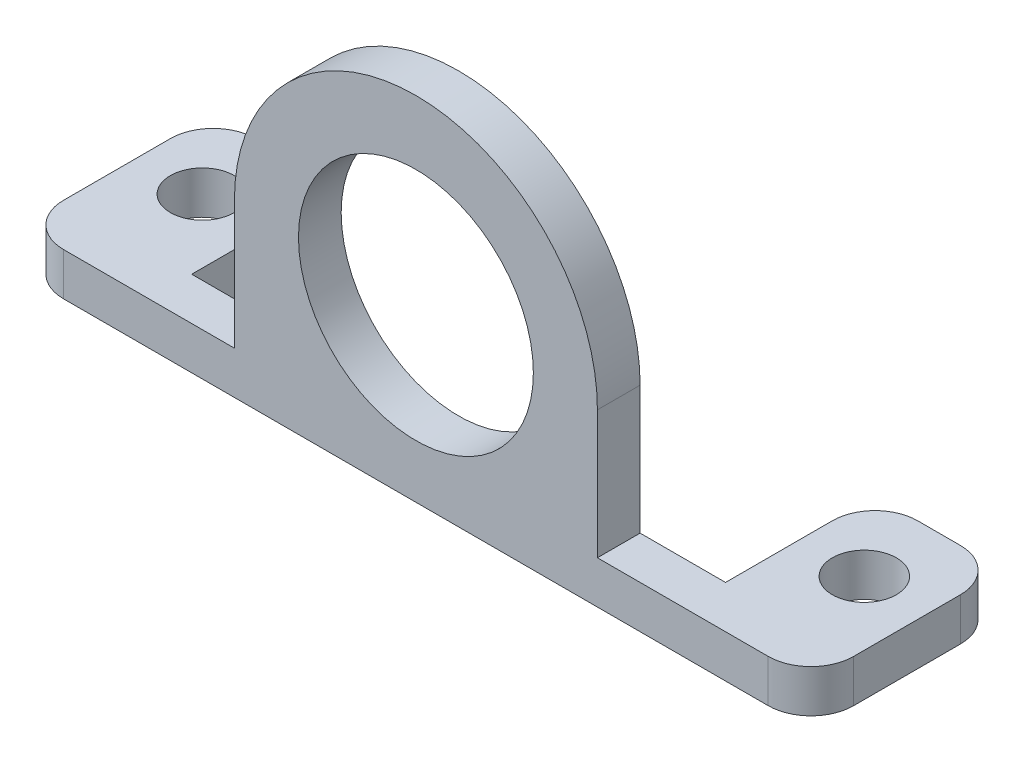
ISO-10303-21;
HEADER;
FILE_DESCRIPTION(('STEP AP214'),'2;1');
FILE_NAME('part.step','',(''),(''),'','','');
FILE_SCHEMA(('AUTOMOTIVE_DESIGN { 1 0 10303 214 1 1 1 1 }'));
ENDSEC;
DATA;
#1=APPLICATION_CONTEXT('core data for automotive mechanical design processes');
#2=APPLICATION_PROTOCOL_DEFINITION('international standard','automotive_design',2000,#1);
#3=PRODUCT_CONTEXT('',#1,'mechanical');
#4=PRODUCT('Part','Part','',(#3));
#5=PRODUCT_RELATED_PRODUCT_CATEGORY('part','',(#4));
#6=PRODUCT_DEFINITION_FORMATION('','',#4);
#7=PRODUCT_DEFINITION_CONTEXT('part definition',#1,'design');
#8=PRODUCT_DEFINITION('design','',#6,#7);
#9=PRODUCT_DEFINITION_SHAPE('','',#8);
#10=(LENGTH_UNIT() NAMED_UNIT(*) SI_UNIT(.MILLI.,.METRE.));
#11=(NAMED_UNIT(*) PLANE_ANGLE_UNIT() SI_UNIT($,.RADIAN.));
#12=(NAMED_UNIT(*) SI_UNIT($,.STERADIAN.) SOLID_ANGLE_UNIT());
#13=UNCERTAINTY_MEASURE_WITH_UNIT(LENGTH_MEASURE(1.E-05),#10,'distance_accuracy_value','');
#14=(GEOMETRIC_REPRESENTATION_CONTEXT(3) GLOBAL_UNCERTAINTY_ASSIGNED_CONTEXT((#13)) GLOBAL_UNIT_ASSIGNED_CONTEXT((#10,
#11,#12)) REPRESENTATION_CONTEXT('',''));
#15=CARTESIAN_POINT('',(0.,0.,0.));
#16=DIRECTION('',(0.,0.,1.));
#17=DIRECTION('',(1.,0.,0.));
#18=AXIS2_PLACEMENT_3D('',#15,#16,#17);
#19=CARTESIAN_POINT('',(0.,2.,0.));
#20=DIRECTION('',(0.,-1.,0.));
#21=DIRECTION('',(0.,0.,-1.));
#22=AXIS2_PLACEMENT_3D('',#19,#20,#21);
#23=PLANE('',#22);
#24=CARTESIAN_POINT('',(15.5,2.,0.));
#25=DIRECTION('',(0.,1.,0.));
#26=DIRECTION('',(0.,0.,-1.));
#27=AXIS2_PLACEMENT_3D('',#24,#25,#26);
#28=CIRCLE('',#27,1.5);
#29=CARTESIAN_POINT('',(15.5,2.,-1.5));
#30=VERTEX_POINT('',#29);
#31=EDGE_CURVE('E210',#30,#30,#28,.T.);
#32=ORIENTED_EDGE('',*,*,#31,.F.);
#33=EDGE_LOOP('',(#32));
#34=FACE_BOUND('',#33,.T.);
#35=DIRECTION('',(1.,0.,0.));
#36=VECTOR('',#35,1.);
#37=CARTESIAN_POINT('',(-18.5,2.,5.5));
#38=LINE('',#37,#36);
#39=CARTESIAN_POINT('',(8.5,2.,5.5));
#40=VERTEX_POINT('',#39);
#41=CARTESIAN_POINT('',(16.5,2.,5.5));
#42=VERTEX_POINT('',#41);
#43=EDGE_CURVE('E232',#40,#42,#38,.T.);
#44=ORIENTED_EDGE('',*,*,#43,.T.);
#45=CARTESIAN_POINT('',(16.5,2.,3.5));
#46=DIRECTION('',(0.,-1.,0.));
#47=DIRECTION('',(0.,0.,-1.));
#48=AXIS2_PLACEMENT_3D('',#45,#46,#47);
#49=CIRCLE('',#48,2.);
#50=CARTESIAN_POINT('',(18.5,2.,3.5));
#51=VERTEX_POINT('',#50);
#52=EDGE_CURVE('E305',#42,#51,#49,.F.);
#53=ORIENTED_EDGE('',*,*,#52,.T.);
#54=DIRECTION('',(0.,0.,-1.));
#55=VECTOR('',#54,1.);
#56=CARTESIAN_POINT('',(18.5,2.,3.5));
#57=LINE('',#56,#55);
#58=CARTESIAN_POINT('',(18.5,2.,-1.5));
#59=VERTEX_POINT('',#58);
#60=EDGE_CURVE('E235',#51,#59,#57,.T.);
#61=ORIENTED_EDGE('',*,*,#60,.T.);
#62=CARTESIAN_POINT('',(16.5,2.,-1.5));
#63=DIRECTION('',(0.,-1.,0.));
#64=DIRECTION('',(0.,0.,-1.));
#65=AXIS2_PLACEMENT_3D('',#62,#63,#64);
#66=CIRCLE('',#65,2.);
#67=CARTESIAN_POINT('',(16.5,2.,-3.5));
#68=VERTEX_POINT('',#67);
#69=EDGE_CURVE('E302',#59,#68,#66,.F.);
#70=ORIENTED_EDGE('',*,*,#69,.T.);
#71=DIRECTION('',(-1.,0.,0.));
#72=VECTOR('',#71,1.);
#73=CARTESIAN_POINT('',(18.5,2.,-3.5));
#74=LINE('',#73,#72);
#75=CARTESIAN_POINT('',(14.5,2.,-3.5));
#76=VERTEX_POINT('',#75);
#77=EDGE_CURVE('E238',#68,#76,#74,.T.);
#78=ORIENTED_EDGE('',*,*,#77,.T.);
#79=CARTESIAN_POINT('',(14.5,2.,-1.5));
#80=DIRECTION('',(0.,-1.,0.));
#81=DIRECTION('',(0.,0.,-1.));
#82=AXIS2_PLACEMENT_3D('',#79,#80,#81);
#83=CIRCLE('',#82,2.);
#84=CARTESIAN_POINT('',(12.5,2.,-1.5));
#85=VERTEX_POINT('',#84);
#86=EDGE_CURVE('E53',#76,#85,#83,.F.);
#87=ORIENTED_EDGE('',*,*,#86,.T.);
#88=DIRECTION('',(0.,0.,1.));
#89=VECTOR('',#88,1.);
#90=CARTESIAN_POINT('',(12.5,2.,3.5));
#91=LINE('',#90,#89);
#92=CARTESIAN_POINT('',(12.5,2.,3.5));
#93=VERTEX_POINT('',#92);
#94=EDGE_CURVE('E240',#85,#93,#91,.T.);
#95=ORIENTED_EDGE('',*,*,#94,.T.);
#96=DIRECTION('',(-1.,0.,0.));
#97=VECTOR('',#96,1.);
#98=CARTESIAN_POINT('',(-12.5,2.,3.5));
#99=LINE('',#98,#97);
#100=CARTESIAN_POINT('',(8.49999999999999,2.,3.5));
#101=VERTEX_POINT('',#100);
#102=EDGE_CURVE('E242',#93,#101,#99,.T.);
#103=ORIENTED_EDGE('',*,*,#102,.T.);
#104=DIRECTION('',(0.,0.,1.));
#105=VECTOR('',#104,1.);
#106=CARTESIAN_POINT('',(8.5,2.,0.));
#107=LINE('',#106,#105);
#108=EDGE_CURVE('E206',#101,#40,#107,.T.);
#109=ORIENTED_EDGE('',*,*,#108,.T.);
#110=EDGE_LOOP('',(#44,#53,#61,#70,#78,#87,#95,#103,#109));
#111=FACE_BOUND('',#110,.T.);
#112=ADVANCED_FACE('F38',(#34,#111),#23,.F.);
#113=DIRECTION('',(0.,0.,1.));
#114=VECTOR('',#113,1.);
#115=CARTESIAN_POINT('',(-18.5,2.,3.5));
#116=LINE('',#115,#114);
#117=CARTESIAN_POINT('',(-18.5,2.,-1.5));
#118=VERTEX_POINT('',#117);
#119=CARTESIAN_POINT('',(-18.5,2.,3.5));
#120=VERTEX_POINT('',#119);
#121=EDGE_CURVE('E229',#118,#120,#116,.T.);
#122=ORIENTED_EDGE('',*,*,#121,.T.);
#123=CARTESIAN_POINT('',(-16.5,2.,3.5));
#124=DIRECTION('',(0.,-1.,0.));
#125=DIRECTION('',(0.,0.,-1.));
#126=AXIS2_PLACEMENT_3D('',#123,#124,#125);
#127=CIRCLE('',#126,2.);
#128=CARTESIAN_POINT('',(-16.5,2.,5.5));
#129=VERTEX_POINT('',#128);
#130=EDGE_CURVE('E295',#120,#129,#127,.F.);
#131=ORIENTED_EDGE('',*,*,#130,.T.);
#132=CARTESIAN_POINT('',(-8.5,2.,5.5));
#133=VERTEX_POINT('',#132);
#134=EDGE_CURVE('E233',#129,#133,#38,.T.);
#135=ORIENTED_EDGE('',*,*,#134,.T.);
#136=DIRECTION('',(0.,0.,-1.));
#137=VECTOR('',#136,1.);
#138=CARTESIAN_POINT('',(-8.5,2.,0.));
#139=LINE('',#138,#137);
#140=CARTESIAN_POINT('',(-8.5,2.,3.5));
#141=VERTEX_POINT('',#140);
#142=EDGE_CURVE('E203',#133,#141,#139,.T.);
#143=ORIENTED_EDGE('',*,*,#142,.T.);
#144=CARTESIAN_POINT('',(-12.5,2.,3.5));
#145=VERTEX_POINT('',#144);
#146=EDGE_CURVE('E186',#141,#145,#99,.T.);
#147=ORIENTED_EDGE('',*,*,#146,.T.);
#148=DIRECTION('',(0.,0.,-1.));
#149=VECTOR('',#148,1.);
#150=CARTESIAN_POINT('',(-12.5,2.,3.5));
#151=LINE('',#150,#149);
#152=CARTESIAN_POINT('',(-12.5,2.,-1.5));
#153=VERTEX_POINT('',#152);
#154=EDGE_CURVE('E222',#145,#153,#151,.T.);
#155=ORIENTED_EDGE('',*,*,#154,.T.);
#156=CARTESIAN_POINT('',(-14.5,2.,-1.5));
#157=DIRECTION('',(0.,-1.,0.));
#158=DIRECTION('',(0.,0.,-1.));
#159=AXIS2_PLACEMENT_3D('',#156,#157,#158);
#160=CIRCLE('',#159,2.);
#161=CARTESIAN_POINT('',(-14.5,2.,-3.5));
#162=VERTEX_POINT('',#161);
#163=EDGE_CURVE('E293',#153,#162,#160,.F.);
#164=ORIENTED_EDGE('',*,*,#163,.T.);
#165=DIRECTION('',(-1.,0.,0.));
#166=VECTOR('',#165,1.);
#167=CARTESIAN_POINT('',(-18.5,2.,-3.5));
#168=LINE('',#167,#166);
#169=CARTESIAN_POINT('',(-16.5,2.,-3.5));
#170=VERTEX_POINT('',#169);
#171=EDGE_CURVE('E225',#162,#170,#168,.T.);
#172=ORIENTED_EDGE('',*,*,#171,.T.);
#173=CARTESIAN_POINT('',(-16.5,2.,-1.5));
#174=DIRECTION('',(0.,-1.,0.));
#175=DIRECTION('',(0.,0.,-1.));
#176=AXIS2_PLACEMENT_3D('',#173,#174,#175);
#177=CIRCLE('',#176,2.);
#178=EDGE_CURVE('E291',#170,#118,#177,.F.);
#179=ORIENTED_EDGE('',*,*,#178,.T.);
#180=EDGE_LOOP('',(#122,#131,#135,#143,#147,#155,#164,#172,#179));
#181=FACE_BOUND('',#180,.T.);
#182=CARTESIAN_POINT('',(-15.5,2.,0.));
#183=DIRECTION('',(0.,1.,0.));
#184=DIRECTION('',(0.,0.,1.));
#185=AXIS2_PLACEMENT_3D('',#182,#183,#184);
#186=CIRCLE('',#185,1.5);
#187=CARTESIAN_POINT('',(-15.5,2.,1.5));
#188=VERTEX_POINT('',#187);
#189=EDGE_CURVE('E216',#188,#188,#186,.T.);
#190=ORIENTED_EDGE('',*,*,#189,.F.);
#191=EDGE_LOOP('',(#190));
#192=FACE_BOUND('',#191,.T.);
#193=ADVANCED_FACE('F339',(#181,#192),#23,.F.);
#194=CARTESIAN_POINT('',(0.,0.,0.));
#195=DIRECTION('',(0.,-1.,0.));
#196=DIRECTION('',(0.,0.,-1.));
#197=AXIS2_PLACEMENT_3D('',#194,#195,#196);
#198=PLANE('',#197);
#199=DIRECTION('',(1.,0.,0.));
#200=VECTOR('',#199,1.);
#201=CARTESIAN_POINT('',(-18.5,0.,5.5));
#202=LINE('',#201,#200);
#203=CARTESIAN_POINT('',(-16.5,0.,5.5));
#204=VERTEX_POINT('',#203);
#205=CARTESIAN_POINT('',(16.5,0.,5.5));
#206=VERTEX_POINT('',#205);
#207=EDGE_CURVE('E253',#204,#206,#202,.T.);
#208=ORIENTED_EDGE('',*,*,#207,.F.);
#209=CARTESIAN_POINT('',(-16.5,0.,3.5));
#210=DIRECTION('',(0.,-1.,0.));
#211=DIRECTION('',(0.,0.,-1.));
#212=AXIS2_PLACEMENT_3D('',#209,#210,#211);
#213=CIRCLE('',#212,2.);
#214=CARTESIAN_POINT('',(-18.5,0.,3.5));
#215=VERTEX_POINT('',#214);
#216=EDGE_CURVE('E284',#204,#215,#213,.T.);
#217=ORIENTED_EDGE('',*,*,#216,.T.);
#218=DIRECTION('',(0.,0.,1.));
#219=VECTOR('',#218,1.);
#220=CARTESIAN_POINT('',(-18.5,0.,3.5));
#221=LINE('',#220,#219);
#222=CARTESIAN_POINT('',(-18.5,0.,-1.5));
#223=VERTEX_POINT('',#222);
#224=EDGE_CURVE('E250',#223,#215,#221,.T.);
#225=ORIENTED_EDGE('',*,*,#224,.F.);
#226=CARTESIAN_POINT('',(-16.5,0.,-1.5));
#227=DIRECTION('',(0.,-1.,0.));
#228=DIRECTION('',(0.,0.,-1.));
#229=AXIS2_PLACEMENT_3D('',#226,#227,#228);
#230=CIRCLE('',#229,2.);
#231=CARTESIAN_POINT('',(-16.5,0.,-3.5));
#232=VERTEX_POINT('',#231);
#233=EDGE_CURVE('E274',#223,#232,#230,.T.);
#234=ORIENTED_EDGE('',*,*,#233,.T.);
#235=DIRECTION('',(-1.,0.,0.));
#236=VECTOR('',#235,1.);
#237=CARTESIAN_POINT('',(-18.5,0.,-3.5));
#238=LINE('',#237,#236);
#239=CARTESIAN_POINT('',(-14.5,0.,-3.5));
#240=VERTEX_POINT('',#239);
#241=EDGE_CURVE('E247',#240,#232,#238,.T.);
#242=ORIENTED_EDGE('',*,*,#241,.F.);
#243=CARTESIAN_POINT('',(-14.5,0.,-1.5));
#244=DIRECTION('',(0.,-1.,0.));
#245=DIRECTION('',(0.,0.,-1.));
#246=AXIS2_PLACEMENT_3D('',#243,#244,#245);
#247=CIRCLE('',#246,2.);
#248=CARTESIAN_POINT('',(-12.5,0.,-1.5));
#249=VERTEX_POINT('',#248);
#250=EDGE_CURVE('E276',#240,#249,#247,.T.);
#251=ORIENTED_EDGE('',*,*,#250,.T.);
#252=DIRECTION('',(0.,0.,-1.));
#253=VECTOR('',#252,1.);
#254=CARTESIAN_POINT('',(-12.5,0.,3.5));
#255=LINE('',#254,#253);
#256=CARTESIAN_POINT('',(-12.5,0.,3.5));
#257=VERTEX_POINT('',#256);
#258=EDGE_CURVE('E219',#257,#249,#255,.T.);
#259=ORIENTED_EDGE('',*,*,#258,.F.);
#260=DIRECTION('',(-1.,0.,0.));
#261=VECTOR('',#260,1.);
#262=CARTESIAN_POINT('',(-12.5,0.,3.5));
#263=LINE('',#262,#261);
#264=CARTESIAN_POINT('',(12.5,0.,3.5));
#265=VERTEX_POINT('',#264);
#266=EDGE_CURVE('E226',#265,#257,#263,.T.);
#267=ORIENTED_EDGE('',*,*,#266,.F.);
#268=DIRECTION('',(0.,0.,1.));
#269=VECTOR('',#268,1.);
#270=CARTESIAN_POINT('',(12.5,0.,3.5));
#271=LINE('',#270,#269);
#272=CARTESIAN_POINT('',(12.5,0.,-1.5));
#273=VERTEX_POINT('',#272);
#274=EDGE_CURVE('E261',#273,#265,#271,.T.);
#275=ORIENTED_EDGE('',*,*,#274,.F.);
#276=CARTESIAN_POINT('',(14.5,0.,-1.5));
#277=DIRECTION('',(0.,-1.,0.));
#278=DIRECTION('',(0.,0.,-1.));
#279=AXIS2_PLACEMENT_3D('',#276,#277,#278);
#280=CIRCLE('',#279,2.);
#281=CARTESIAN_POINT('',(14.5,0.,-3.5));
#282=VERTEX_POINT('',#281);
#283=EDGE_CURVE('E280',#273,#282,#280,.T.);
#284=ORIENTED_EDGE('',*,*,#283,.T.);
#285=DIRECTION('',(-1.,0.,0.));
#286=VECTOR('',#285,1.);
#287=CARTESIAN_POINT('',(18.5,0.,-3.5));
#288=LINE('',#287,#286);
#289=CARTESIAN_POINT('',(16.5,0.,-3.5));
#290=VERTEX_POINT('',#289);
#291=EDGE_CURVE('E259',#290,#282,#288,.T.);
#292=ORIENTED_EDGE('',*,*,#291,.F.);
#293=CARTESIAN_POINT('',(16.5,0.,-1.5));
#294=DIRECTION('',(0.,-1.,0.));
#295=DIRECTION('',(0.,0.,-1.));
#296=AXIS2_PLACEMENT_3D('',#293,#294,#295);
#297=CIRCLE('',#296,2.);
#298=CARTESIAN_POINT('',(18.5,0.,-1.5));
#299=VERTEX_POINT('',#298);
#300=EDGE_CURVE('E278',#290,#299,#297,.T.);
#301=ORIENTED_EDGE('',*,*,#300,.T.);
#302=DIRECTION('',(0.,0.,-1.));
#303=VECTOR('',#302,1.);
#304=CARTESIAN_POINT('',(18.5,0.,3.5));
#305=LINE('',#304,#303);
#306=CARTESIAN_POINT('',(18.5,0.,3.5));
#307=VERTEX_POINT('',#306);
#308=EDGE_CURVE('E256',#307,#299,#305,.T.);
#309=ORIENTED_EDGE('',*,*,#308,.F.);
#310=CARTESIAN_POINT('',(16.5,0.,3.5));
#311=DIRECTION('',(0.,-1.,0.));
#312=DIRECTION('',(0.,0.,-1.));
#313=AXIS2_PLACEMENT_3D('',#310,#311,#312);
#314=CIRCLE('',#313,2.);
#315=EDGE_CURVE('E282',#307,#206,#314,.T.);
#316=ORIENTED_EDGE('',*,*,#315,.T.);
#317=EDGE_LOOP('',(#208,#217,#225,#234,#242,#251,#259,#267,#275,#284,#292,#301,#309,#316));
#318=FACE_BOUND('',#317,.T.);
#319=CARTESIAN_POINT('',(-15.5,0.,0.));
#320=DIRECTION('',(0.,1.,0.));
#321=DIRECTION('',(0.,0.,1.));
#322=AXIS2_PLACEMENT_3D('',#319,#320,#321);
#323=CIRCLE('',#322,1.5);
#324=CARTESIAN_POINT('',(-15.5,0.,1.5));
#325=VERTEX_POINT('',#324);
#326=EDGE_CURVE('E213',#325,#325,#323,.T.);
#327=ORIENTED_EDGE('',*,*,#326,.T.);
#328=EDGE_LOOP('',(#327));
#329=FACE_BOUND('',#328,.T.);
#330=CARTESIAN_POINT('',(15.5,0.,0.));
#331=DIRECTION('',(0.,1.,0.));
#332=DIRECTION('',(0.,0.,-1.));
#333=AXIS2_PLACEMENT_3D('',#330,#331,#332);
#334=CIRCLE('',#333,1.5);
#335=CARTESIAN_POINT('',(15.5,0.,-1.5));
#336=VERTEX_POINT('',#335);
#337=EDGE_CURVE('E209',#336,#336,#334,.T.);
#338=ORIENTED_EDGE('',*,*,#337,.T.);
#339=EDGE_LOOP('',(#338));
#340=FACE_BOUND('',#339,.T.);
#341=ADVANCED_FACE('F326',(#318,#329,#340),#198,.T.);
#342=CARTESIAN_POINT('',(-12.5,2.,3.5));
#343=DIRECTION('',(-1.,0.,0.));
#344=DIRECTION('',(0.,0.,1.));
#345=AXIS2_PLACEMENT_3D('',#342,#343,#344);
#346=PLANE('',#345);
#347=ORIENTED_EDGE('',*,*,#258,.T.);
#348=DIRECTION('',(0.,-1.,0.));
#349=VECTOR('',#348,1.);
#350=CARTESIAN_POINT('',(-12.5,2.,-1.5));
#351=LINE('',#350,#349);
#352=EDGE_CURVE('E11',#249,#153,#351,.F.);
#353=ORIENTED_EDGE('',*,*,#352,.T.);
#354=ORIENTED_EDGE('',*,*,#154,.F.);
#355=DIRECTION('',(0.,-1.,0.));
#356=VECTOR('',#355,1.);
#357=CARTESIAN_POINT('',(-12.5,2.,3.5));
#358=LINE('',#357,#356);
#359=EDGE_CURVE('E244',#145,#257,#358,.T.);
#360=ORIENTED_EDGE('',*,*,#359,.T.);
#361=EDGE_LOOP('',(#347,#353,#354,#360));
#362=FACE_BOUND('',#361,.T.);
#363=ADVANCED_FACE('F401',(#362),#346,.F.);
#364=CARTESIAN_POINT('',(-18.5,2.,-3.5));
#365=DIRECTION('',(0.,0.,1.));
#366=DIRECTION('',(1.,0.,0.));
#367=AXIS2_PLACEMENT_3D('',#364,#365,#366);
#368=PLANE('',#367);
#369=ORIENTED_EDGE('',*,*,#171,.F.);
#370=DIRECTION('',(0.,-1.,0.));
#371=VECTOR('',#370,1.);
#372=CARTESIAN_POINT('',(-14.5,2.,-3.5));
#373=LINE('',#372,#371);
#374=EDGE_CURVE('E46',#162,#240,#373,.T.);
#375=ORIENTED_EDGE('',*,*,#374,.T.);
#376=ORIENTED_EDGE('',*,*,#241,.T.);
#377=DIRECTION('',(0.,-1.,0.));
#378=VECTOR('',#377,1.);
#379=CARTESIAN_POINT('',(-16.5,2.,-3.5));
#380=LINE('',#379,#378);
#381=EDGE_CURVE('E314',#232,#170,#380,.F.);
#382=ORIENTED_EDGE('',*,*,#381,.T.);
#383=EDGE_LOOP('',(#369,#375,#376,#382));
#384=FACE_BOUND('',#383,.T.);
#385=ADVANCED_FACE('F320',(#384),#368,.F.);
#386=CARTESIAN_POINT('',(-18.5,2.,3.5));
#387=DIRECTION('',(1.,0.,0.));
#388=DIRECTION('',(0.,0.,-1.));
#389=AXIS2_PLACEMENT_3D('',#386,#387,#388);
#390=PLANE('',#389);
#391=ORIENTED_EDGE('',*,*,#224,.T.);
#392=DIRECTION('',(0.,-1.,0.));
#393=VECTOR('',#392,1.);
#394=CARTESIAN_POINT('',(-18.5,2.,3.5));
#395=LINE('',#394,#393);
#396=EDGE_CURVE('E289',#215,#120,#395,.F.);
#397=ORIENTED_EDGE('',*,*,#396,.T.);
#398=ORIENTED_EDGE('',*,*,#121,.F.);
#399=DIRECTION('',(0.,-1.,0.));
#400=VECTOR('',#399,1.);
#401=CARTESIAN_POINT('',(-18.5,2.,-1.5));
#402=LINE('',#401,#400);
#403=EDGE_CURVE('E286',#118,#223,#402,.T.);
#404=ORIENTED_EDGE('',*,*,#403,.T.);
#405=EDGE_LOOP('',(#391,#397,#398,#404));
#406=FACE_BOUND('',#405,.T.);
#407=ADVANCED_FACE('F335',(#406),#390,.F.);
#408=CARTESIAN_POINT('',(-18.5,2.,5.5));
#409=DIRECTION('',(0.,0.,-1.));
#410=DIRECTION('',(-1.,0.,0.));
#411=AXIS2_PLACEMENT_3D('',#408,#409,#410);
#412=PLANE('',#411);
#413=ORIENTED_EDGE('',*,*,#134,.F.);
#414=DIRECTION('',(0.,-1.,0.));
#415=VECTOR('',#414,1.);
#416=CARTESIAN_POINT('',(-16.5,2.,5.5));
#417=LINE('',#416,#415);
#418=EDGE_CURVE('E271',#129,#204,#417,.T.);
#419=ORIENTED_EDGE('',*,*,#418,.T.);
#420=ORIENTED_EDGE('',*,*,#207,.T.);
#421=DIRECTION('',(0.,-1.,0.));
#422=VECTOR('',#421,1.);
#423=CARTESIAN_POINT('',(16.5,2.,5.5));
#424=LINE('',#423,#422);
#425=EDGE_CURVE('E269',#206,#42,#424,.F.);
#426=ORIENTED_EDGE('',*,*,#425,.T.);
#427=ORIENTED_EDGE('',*,*,#43,.F.);
#428=DIRECTION('',(0.,1.,0.));
#429=VECTOR('',#428,1.);
#430=CARTESIAN_POINT('',(8.5,0.,5.5));
#431=LINE('',#430,#429);
#432=CARTESIAN_POINT('',(8.5,8.,5.5));
#433=VERTEX_POINT('',#432);
#434=EDGE_CURVE('E191',#40,#433,#431,.T.);
#435=ORIENTED_EDGE('',*,*,#434,.T.);
#436=CARTESIAN_POINT('',(0.,8.,5.5));
#437=DIRECTION('',(0.,0.,1.));
#438=DIRECTION('',(1.,0.,0.));
#439=AXIS2_PLACEMENT_3D('',#436,#437,#438);
#440=CIRCLE('',#439,8.5);
#441=CARTESIAN_POINT('',(-8.5,8.,5.5));
#442=VERTEX_POINT('',#441);
#443=EDGE_CURVE('E199',#433,#442,#440,.T.);
#444=ORIENTED_EDGE('',*,*,#443,.T.);
#445=DIRECTION('',(0.,-1.,0.));
#446=VECTOR('',#445,1.);
#447=CARTESIAN_POINT('',(-8.5,8.,5.5));
#448=LINE('',#447,#446);
#449=EDGE_CURVE('E170',#442,#133,#448,.T.);
#450=ORIENTED_EDGE('',*,*,#449,.T.);
#451=EDGE_LOOP('',(#413,#419,#420,#426,#427,#435,#444,#450));
#452=FACE_BOUND('',#451,.T.);
#453=CARTESIAN_POINT('',(0.,8.,5.5));
#454=DIRECTION('',(0.,0.,1.));
#455=DIRECTION('',(1.,0.,0.));
#456=AXIS2_PLACEMENT_3D('',#453,#454,#455);
#457=CIRCLE('',#456,5.5);
#458=CARTESIAN_POINT('',(5.5,8.,5.5));
#459=VERTEX_POINT('',#458);
#460=EDGE_CURVE('E195',#459,#459,#457,.T.);
#461=ORIENTED_EDGE('',*,*,#460,.F.);
#462=EDGE_LOOP('',(#461));
#463=FACE_BOUND('',#462,.T.);
#464=ADVANCED_FACE('F346',(#452,#463),#412,.F.);
#465=CARTESIAN_POINT('',(18.5,2.,3.5));
#466=DIRECTION('',(-1.,0.,0.));
#467=DIRECTION('',(0.,0.,1.));
#468=AXIS2_PLACEMENT_3D('',#465,#466,#467);
#469=PLANE('',#468);
#470=ORIENTED_EDGE('',*,*,#60,.F.);
#471=DIRECTION('',(0.,-1.,0.));
#472=VECTOR('',#471,1.);
#473=CARTESIAN_POINT('',(18.5,2.,3.5));
#474=LINE('',#473,#472);
#475=EDGE_CURVE('E299',#51,#307,#474,.T.);
#476=ORIENTED_EDGE('',*,*,#475,.T.);
#477=ORIENTED_EDGE('',*,*,#308,.T.);
#478=DIRECTION('',(0.,-1.,0.));
#479=VECTOR('',#478,1.);
#480=CARTESIAN_POINT('',(18.5,2.,-1.5));
#481=LINE('',#480,#479);
#482=EDGE_CURVE('E297',#299,#59,#481,.F.);
#483=ORIENTED_EDGE('',*,*,#482,.T.);
#484=EDGE_LOOP('',(#470,#476,#477,#483));
#485=FACE_BOUND('',#484,.T.);
#486=ADVANCED_FACE('F356',(#485),#469,.F.);
#487=CARTESIAN_POINT('',(18.5,2.,-3.5));
#488=DIRECTION('',(0.,0.,1.));
#489=DIRECTION('',(1.,0.,0.));
#490=AXIS2_PLACEMENT_3D('',#487,#488,#489);
#491=PLANE('',#490);
#492=ORIENTED_EDGE('',*,*,#291,.T.);
#493=DIRECTION('',(0.,-1.,0.));
#494=VECTOR('',#493,1.);
#495=CARTESIAN_POINT('',(14.5,2.,-3.5));
#496=LINE('',#495,#494);
#497=EDGE_CURVE('E61',#282,#76,#496,.F.);
#498=ORIENTED_EDGE('',*,*,#497,.T.);
#499=ORIENTED_EDGE('',*,*,#77,.F.);
#500=DIRECTION('',(0.,-1.,0.));
#501=VECTOR('',#500,1.);
#502=CARTESIAN_POINT('',(16.5,2.,-3.5));
#503=LINE('',#502,#501);
#504=EDGE_CURVE('E310',#68,#290,#503,.T.);
#505=ORIENTED_EDGE('',*,*,#504,.T.);
#506=EDGE_LOOP('',(#492,#498,#499,#505));
#507=FACE_BOUND('',#506,.T.);
#508=ADVANCED_FACE('F364',(#507),#491,.F.);
#509=CARTESIAN_POINT('',(12.5,2.,3.5));
#510=DIRECTION('',(1.,0.,0.));
#511=DIRECTION('',(0.,0.,-1.));
#512=AXIS2_PLACEMENT_3D('',#509,#510,#511);
#513=PLANE('',#512);
#514=ORIENTED_EDGE('',*,*,#94,.F.);
#515=DIRECTION('',(0.,-1.,0.));
#516=VECTOR('',#515,1.);
#517=CARTESIAN_POINT('',(12.5,2.,-1.5));
#518=LINE('',#517,#516);
#519=EDGE_CURVE('E307',#85,#273,#518,.T.);
#520=ORIENTED_EDGE('',*,*,#519,.T.);
#521=ORIENTED_EDGE('',*,*,#274,.T.);
#522=DIRECTION('',(0.,-1.,0.));
#523=VECTOR('',#522,1.);
#524=CARTESIAN_POINT('',(12.5,2.,3.5));
#525=LINE('',#524,#523);
#526=EDGE_CURVE('E266',#93,#265,#525,.T.);
#527=ORIENTED_EDGE('',*,*,#526,.F.);
#528=EDGE_LOOP('',(#514,#520,#521,#527));
#529=FACE_BOUND('',#528,.T.);
#530=ADVANCED_FACE('F371',(#529),#513,.F.);
#531=CARTESIAN_POINT('',(-12.5,2.,3.5));
#532=DIRECTION('',(0.,0.,1.));
#533=DIRECTION('',(1.,0.,0.));
#534=AXIS2_PLACEMENT_3D('',#531,#532,#533);
#535=PLANE('',#534);
#536=ORIENTED_EDGE('',*,*,#146,.F.);
#537=DIRECTION('',(0.,-1.,0.));
#538=VECTOR('',#537,1.);
#539=CARTESIAN_POINT('',(-8.5,8.,3.5));
#540=LINE('',#539,#538);
#541=CARTESIAN_POINT('',(-8.5,8.,3.5));
#542=VERTEX_POINT('',#541);
#543=EDGE_CURVE('E168',#542,#141,#540,.T.);
#544=ORIENTED_EDGE('',*,*,#543,.F.);
#545=CARTESIAN_POINT('',(0.,8.,3.5));
#546=DIRECTION('',(0.,0.,1.));
#547=DIRECTION('',(1.,0.,0.));
#548=AXIS2_PLACEMENT_3D('',#545,#546,#547);
#549=CIRCLE('',#548,8.5);
#550=CARTESIAN_POINT('',(8.5,8.,3.5));
#551=VERTEX_POINT('',#550);
#552=EDGE_CURVE('E184',#551,#542,#549,.T.);
#553=ORIENTED_EDGE('',*,*,#552,.F.);
#554=DIRECTION('',(0.,1.,0.));
#555=VECTOR('',#554,1.);
#556=CARTESIAN_POINT('',(8.5,0.,3.5));
#557=LINE('',#556,#555);
#558=EDGE_CURVE('E176',#101,#551,#557,.T.);
#559=ORIENTED_EDGE('',*,*,#558,.F.);
#560=ORIENTED_EDGE('',*,*,#102,.F.);
#561=ORIENTED_EDGE('',*,*,#526,.T.);
#562=ORIENTED_EDGE('',*,*,#266,.T.);
#563=ORIENTED_EDGE('',*,*,#359,.F.);
#564=EDGE_LOOP('',(#536,#544,#553,#559,#560,#561,#562,#563));
#565=FACE_BOUND('',#564,.T.);
#566=CARTESIAN_POINT('',(0.,8.,3.5));
#567=DIRECTION('',(0.,0.,1.));
#568=DIRECTION('',(1.,0.,0.));
#569=AXIS2_PLACEMENT_3D('',#566,#567,#568);
#570=CIRCLE('',#569,5.5);
#571=CARTESIAN_POINT('',(5.5,8.,3.5));
#572=VERTEX_POINT('',#571);
#573=EDGE_CURVE('E201',#572,#572,#570,.T.);
#574=ORIENTED_EDGE('',*,*,#573,.T.);
#575=EDGE_LOOP('',(#574));
#576=FACE_BOUND('',#575,.T.);
#577=ADVANCED_FACE('F181',(#565,#576),#535,.F.);
#578=CARTESIAN_POINT('',(-15.5,2.,0.));
#579=DIRECTION('',(0.,-1.,0.));
#580=DIRECTION('',(0.,0.,-1.));
#581=AXIS2_PLACEMENT_3D('',#578,#579,#580);
#582=CYLINDRICAL_SURFACE('',#581,1.5);
#583=ORIENTED_EDGE('',*,*,#189,.T.);
#584=EDGE_LOOP('',(#583));
#585=FACE_BOUND('',#584,.T.);
#586=ORIENTED_EDGE('',*,*,#326,.F.);
#587=EDGE_LOOP('',(#586));
#588=FACE_BOUND('',#587,.T.);
#589=ADVANCED_FACE('F386',(#585,#588),#582,.F.);
#590=CARTESIAN_POINT('',(15.5,2.,0.));
#591=DIRECTION('',(0.,-1.,0.));
#592=DIRECTION('',(0.,0.,-1.));
#593=AXIS2_PLACEMENT_3D('',#590,#591,#592);
#594=CYLINDRICAL_SURFACE('',#593,1.5);
#595=ORIENTED_EDGE('',*,*,#31,.T.);
#596=EDGE_LOOP('',(#595));
#597=FACE_BOUND('',#596,.T.);
#598=ORIENTED_EDGE('',*,*,#337,.F.);
#599=EDGE_LOOP('',(#598));
#600=FACE_BOUND('',#599,.T.);
#601=ADVANCED_FACE('F379',(#597,#600),#594,.F.);
#602=CARTESIAN_POINT('',(8.5,0.,3.5));
#603=DIRECTION('',(1.,0.,0.));
#604=DIRECTION('',(0.,0.,-1.));
#605=AXIS2_PLACEMENT_3D('',#602,#603,#604);
#606=PLANE('',#605);
#607=ORIENTED_EDGE('',*,*,#108,.F.);
#608=ORIENTED_EDGE('',*,*,#558,.T.);
#609=DIRECTION('',(0.,0.,1.));
#610=VECTOR('',#609,1.);
#611=CARTESIAN_POINT('',(8.5,8.,3.5));
#612=LINE('',#611,#610);
#613=EDGE_CURVE('E175',#551,#433,#612,.T.);
#614=ORIENTED_EDGE('',*,*,#613,.T.);
#615=ORIENTED_EDGE('',*,*,#434,.F.);
#616=EDGE_LOOP('',(#607,#608,#614,#615));
#617=FACE_BOUND('',#616,.T.);
#618=ADVANCED_FACE('F377',(#617),#606,.T.);
#619=CARTESIAN_POINT('',(-8.5,8.,3.5));
#620=DIRECTION('',(-1.,0.,0.));
#621=DIRECTION('',(0.,-1.,0.));
#622=AXIS2_PLACEMENT_3D('',#619,#620,#621);
#623=PLANE('',#622);
#624=ORIENTED_EDGE('',*,*,#142,.F.);
#625=ORIENTED_EDGE('',*,*,#449,.F.);
#626=DIRECTION('',(0.,0.,1.));
#627=VECTOR('',#626,1.);
#628=CARTESIAN_POINT('',(-8.5,8.,3.5));
#629=LINE('',#628,#627);
#630=EDGE_CURVE('E164',#542,#442,#629,.T.);
#631=ORIENTED_EDGE('',*,*,#630,.F.);
#632=ORIENTED_EDGE('',*,*,#543,.T.);
#633=EDGE_LOOP('',(#624,#625,#631,#632));
#634=FACE_BOUND('',#633,.T.);
#635=ADVANCED_FACE('F167',(#634),#623,.T.);
#636=CARTESIAN_POINT('',(0.,8.,3.5));
#637=DIRECTION('',(0.,0.,1.));
#638=DIRECTION('',(1.,0.,0.));
#639=AXIS2_PLACEMENT_3D('',#636,#637,#638);
#640=CYLINDRICAL_SURFACE('',#639,8.5);
#641=ORIENTED_EDGE('',*,*,#443,.F.);
#642=ORIENTED_EDGE('',*,*,#613,.F.);
#643=ORIENTED_EDGE('',*,*,#552,.T.);
#644=ORIENTED_EDGE('',*,*,#630,.T.);
#645=EDGE_LOOP('',(#641,#642,#643,#644));
#646=FACE_BOUND('',#645,.T.);
#647=ADVANCED_FACE('F189',(#646),#640,.T.);
#648=CARTESIAN_POINT('',(0.,8.,3.5));
#649=DIRECTION('',(0.,0.,1.));
#650=DIRECTION('',(1.,0.,0.));
#651=AXIS2_PLACEMENT_3D('',#648,#649,#650);
#652=CYLINDRICAL_SURFACE('',#651,5.5);
#653=ORIENTED_EDGE('',*,*,#573,.F.);
#654=EDGE_LOOP('',(#653));
#655=FACE_BOUND('',#654,.T.);
#656=ORIENTED_EDGE('',*,*,#460,.T.);
#657=EDGE_LOOP('',(#656));
#658=FACE_BOUND('',#657,.T.);
#659=ADVANCED_FACE('F421',(#655,#658),#652,.F.);
#660=CARTESIAN_POINT('',(-16.5,2.,3.5));
#661=DIRECTION('',(0.,-1.,0.));
#662=DIRECTION('',(0.,0.,-1.));
#663=AXIS2_PLACEMENT_3D('',#660,#661,#662);
#664=CYLINDRICAL_SURFACE('',#663,2.);
#665=ORIENTED_EDGE('',*,*,#130,.F.);
#666=ORIENTED_EDGE('',*,*,#396,.F.);
#667=ORIENTED_EDGE('',*,*,#216,.F.);
#668=ORIENTED_EDGE('',*,*,#418,.F.);
#669=EDGE_LOOP('',(#665,#666,#667,#668));
#670=FACE_BOUND('',#669,.T.);
#671=ADVANCED_FACE('F344',(#670),#664,.T.);
#672=CARTESIAN_POINT('',(16.5,2.,3.5));
#673=DIRECTION('',(0.,-1.,0.));
#674=DIRECTION('',(0.,0.,-1.));
#675=AXIS2_PLACEMENT_3D('',#672,#673,#674);
#676=CYLINDRICAL_SURFACE('',#675,2.);
#677=ORIENTED_EDGE('',*,*,#52,.F.);
#678=ORIENTED_EDGE('',*,*,#425,.F.);
#679=ORIENTED_EDGE('',*,*,#315,.F.);
#680=ORIENTED_EDGE('',*,*,#475,.F.);
#681=EDGE_LOOP('',(#677,#678,#679,#680));
#682=FACE_BOUND('',#681,.T.);
#683=ADVANCED_FACE('F353',(#682),#676,.T.);
#684=CARTESIAN_POINT('',(14.5,2.,-1.5));
#685=DIRECTION('',(0.,-1.,0.));
#686=DIRECTION('',(0.,0.,-1.));
#687=AXIS2_PLACEMENT_3D('',#684,#685,#686);
#688=CYLINDRICAL_SURFACE('',#687,2.);
#689=ORIENTED_EDGE('',*,*,#86,.F.);
#690=ORIENTED_EDGE('',*,*,#497,.F.);
#691=ORIENTED_EDGE('',*,*,#283,.F.);
#692=ORIENTED_EDGE('',*,*,#519,.F.);
#693=EDGE_LOOP('',(#689,#690,#691,#692));
#694=FACE_BOUND('',#693,.T.);
#695=ADVANCED_FACE('F369',(#694),#688,.T.);
#696=CARTESIAN_POINT('',(16.5,2.,-1.5));
#697=DIRECTION('',(0.,-1.,0.));
#698=DIRECTION('',(0.,0.,-1.));
#699=AXIS2_PLACEMENT_3D('',#696,#697,#698);
#700=CYLINDRICAL_SURFACE('',#699,2.);
#701=ORIENTED_EDGE('',*,*,#69,.F.);
#702=ORIENTED_EDGE('',*,*,#482,.F.);
#703=ORIENTED_EDGE('',*,*,#300,.F.);
#704=ORIENTED_EDGE('',*,*,#504,.F.);
#705=EDGE_LOOP('',(#701,#702,#703,#704));
#706=FACE_BOUND('',#705,.T.);
#707=ADVANCED_FACE('F362',(#706),#700,.T.);
#708=CARTESIAN_POINT('',(-14.5,2.,-1.5));
#709=DIRECTION('',(0.,-1.,0.));
#710=DIRECTION('',(0.,0.,-1.));
#711=AXIS2_PLACEMENT_3D('',#708,#709,#710);
#712=CYLINDRICAL_SURFACE('',#711,2.);
#713=ORIENTED_EDGE('',*,*,#163,.F.);
#714=ORIENTED_EDGE('',*,*,#352,.F.);
#715=ORIENTED_EDGE('',*,*,#250,.F.);
#716=ORIENTED_EDGE('',*,*,#374,.F.);
#717=EDGE_LOOP('',(#713,#714,#715,#716));
#718=FACE_BOUND('',#717,.T.);
#719=ADVANCED_FACE('F427',(#718),#712,.T.);
#720=CARTESIAN_POINT('',(-16.5,2.,-1.5));
#721=DIRECTION('',(0.,-1.,0.));
#722=DIRECTION('',(0.,0.,-1.));
#723=AXIS2_PLACEMENT_3D('',#720,#721,#722);
#724=CYLINDRICAL_SURFACE('',#723,2.);
#725=ORIENTED_EDGE('',*,*,#178,.F.);
#726=ORIENTED_EDGE('',*,*,#381,.F.);
#727=ORIENTED_EDGE('',*,*,#233,.F.);
#728=ORIENTED_EDGE('',*,*,#403,.F.);
#729=EDGE_LOOP('',(#725,#726,#727,#728));
#730=FACE_BOUND('',#729,.T.);
#731=ADVANCED_FACE('F40',(#730),#724,.T.);
#732=CLOSED_SHELL('',(#112,#193,#341,#363,#385,#407,#464,#486,#508,#530,#577,#589,#601,#618,
#635,#647,#659,#671,#683,#695,#707,#719,#731));
#733=MANIFOLD_SOLID_BREP('B2',#732);
#734=ADVANCED_BREP_SHAPE_REPRESENTATION('',(#18,#733),#14);
#735=SHAPE_DEFINITION_REPRESENTATION(#9,#734);
ENDSEC;
END-ISO-10303-21;
